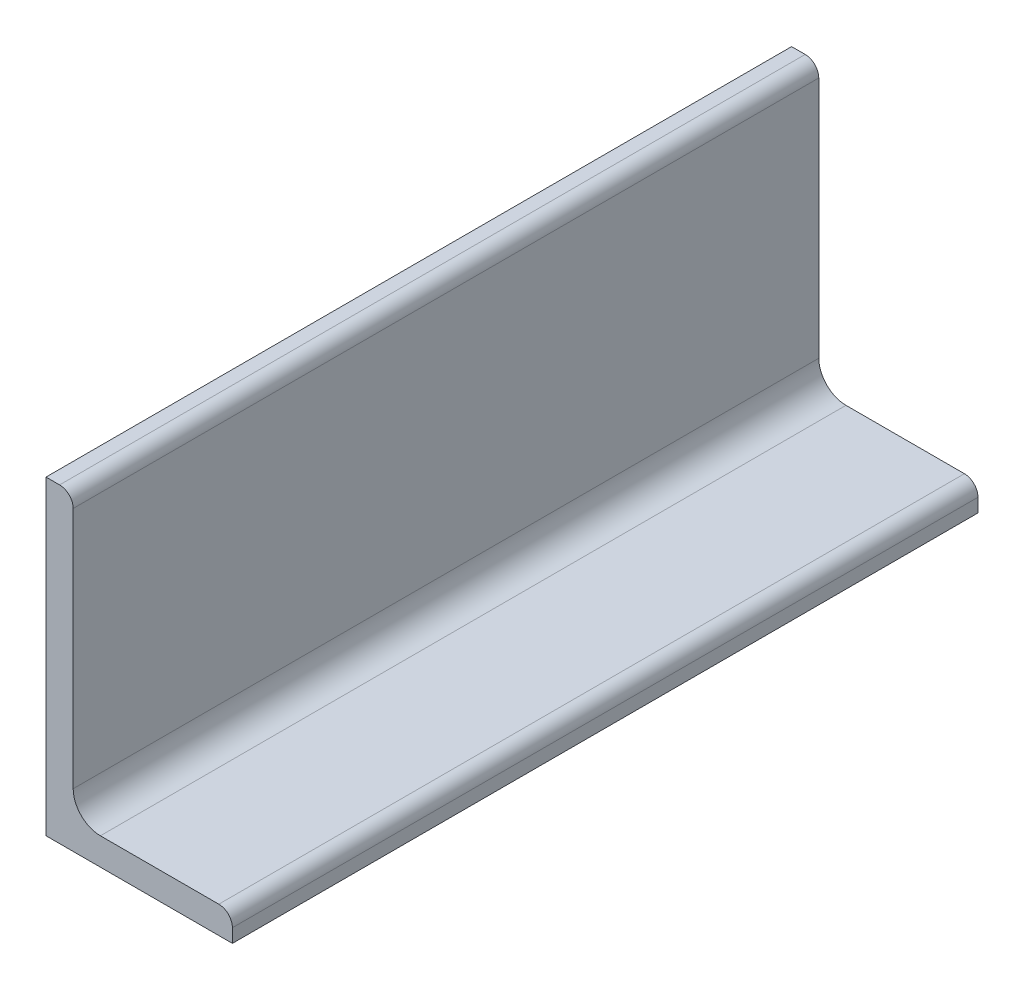
ISO-10303-21;
HEADER;
FILE_DESCRIPTION(('STEP AP214'),'2;1');
FILE_NAME('part.step','',(''),(''),'','','');
FILE_SCHEMA(('AUTOMOTIVE_DESIGN { 1 0 10303 214 1 1 1 1 }'));
ENDSEC;
DATA;
#1=APPLICATION_CONTEXT('core data for automotive mechanical design processes');
#2=APPLICATION_PROTOCOL_DEFINITION('international standard','automotive_design',2000,#1);
#3=PRODUCT_CONTEXT('',#1,'mechanical');
#4=PRODUCT('Part','Part','',(#3));
#5=PRODUCT_RELATED_PRODUCT_CATEGORY('part','',(#4));
#6=PRODUCT_DEFINITION_FORMATION('','',#4);
#7=PRODUCT_DEFINITION_CONTEXT('part definition',#1,'design');
#8=PRODUCT_DEFINITION('design','',#6,#7);
#9=PRODUCT_DEFINITION_SHAPE('','',#8);
#10=(LENGTH_UNIT() NAMED_UNIT(*) SI_UNIT(.MILLI.,.METRE.));
#11=(NAMED_UNIT(*) PLANE_ANGLE_UNIT() SI_UNIT($,.RADIAN.));
#12=(NAMED_UNIT(*) SI_UNIT($,.STERADIAN.) SOLID_ANGLE_UNIT());
#13=UNCERTAINTY_MEASURE_WITH_UNIT(LENGTH_MEASURE(1.E-05),#10,'distance_accuracy_value','');
#14=(GEOMETRIC_REPRESENTATION_CONTEXT(3) GLOBAL_UNCERTAINTY_ASSIGNED_CONTEXT((#13)) GLOBAL_UNIT_ASSIGNED_CONTEXT((#10,
#11,#12)) REPRESENTATION_CONTEXT('',''));
#15=CARTESIAN_POINT('',(0.,0.,0.));
#16=DIRECTION('',(0.,0.,1.));
#17=DIRECTION('',(1.,0.,0.));
#18=AXIS2_PLACEMENT_3D('',#15,#16,#17);
#19=CARTESIAN_POINT('',(0.490776827053332,127.041655270204,304.8));
#20=DIRECTION('',(1.,0.,0.));
#21=DIRECTION('',(0.,0.,-1.));
#22=AXIS2_PLACEMENT_3D('',#19,#20,#21);
#23=PLANE('',#22);
#24=DIRECTION('',(0.,-1.,0.));
#25=VECTOR('',#24,1.);
#26=CARTESIAN_POINT('',(0.490776827053332,127.041655270204,0.));
#27=LINE('',#26,#25);
#28=CARTESIAN_POINT('',(0.490776827053332,127.041655270204,0.));
#29=VERTEX_POINT('',#28);
#30=CARTESIAN_POINT('',(0.490776827053332,0.0416552702040917,0.));
#31=VERTEX_POINT('',#30);
#32=EDGE_CURVE('E135',#29,#31,#27,.T.);
#33=ORIENTED_EDGE('',*,*,#32,.T.);
#34=DIRECTION('',(0.,0.,-1.));
#35=VECTOR('',#34,1.);
#36=CARTESIAN_POINT('',(0.490776827053332,0.0416552702040917,304.8));
#37=LINE('',#36,#35);
#38=CARTESIAN_POINT('',(0.490776827053332,0.0416552702040917,304.8));
#39=VERTEX_POINT('',#38);
#40=EDGE_CURVE('E11',#39,#31,#37,.T.);
#41=ORIENTED_EDGE('',*,*,#40,.F.);
#42=DIRECTION('',(0.,-1.,0.));
#43=VECTOR('',#42,1.);
#44=CARTESIAN_POINT('',(0.490776827053332,127.041655270204,304.8));
#45=LINE('',#44,#43);
#46=CARTESIAN_POINT('',(0.490776827053332,127.041655270204,304.8));
#47=VERTEX_POINT('',#46);
#48=EDGE_CURVE('E151',#47,#39,#45,.T.);
#49=ORIENTED_EDGE('',*,*,#48,.F.);
#50=DIRECTION('',(0.,0.,-1.));
#51=VECTOR('',#50,1.);
#52=CARTESIAN_POINT('',(0.490776827053332,127.041655270204,304.8));
#53=LINE('',#52,#51);
#54=EDGE_CURVE('E131',#47,#29,#53,.T.);
#55=ORIENTED_EDGE('',*,*,#54,.T.);
#56=EDGE_LOOP('',(#33,#41,#49,#55));
#57=FACE_BOUND('',#56,.T.);
#58=ADVANCED_FACE('F33',(#57),#23,.F.);
#59=CARTESIAN_POINT('',(0.490776827053332,0.0416552702040917,304.8));
#60=DIRECTION('',(0.,1.,0.));
#61=DIRECTION('',(0.,0.,1.));
#62=AXIS2_PLACEMENT_3D('',#59,#60,#61);
#63=PLANE('',#62);
#64=DIRECTION('',(1.,0.,0.));
#65=VECTOR('',#64,1.);
#66=CARTESIAN_POINT('',(0.490776827053332,0.0416552702040917,0.));
#67=LINE('',#66,#65);
#68=CARTESIAN_POINT('',(76.6907768270533,0.0416552702040917,0.));
#69=VERTEX_POINT('',#68);
#70=EDGE_CURVE('E138',#31,#69,#67,.T.);
#71=ORIENTED_EDGE('',*,*,#70,.T.);
#72=DIRECTION('',(0.,0.,-1.));
#73=VECTOR('',#72,1.);
#74=CARTESIAN_POINT('',(76.6907768270533,0.0416552702040917,304.8));
#75=LINE('',#74,#73);
#76=CARTESIAN_POINT('',(76.6907768270533,0.0416552702040917,304.8));
#77=VERTEX_POINT('',#76);
#78=EDGE_CURVE('E41',#77,#69,#75,.T.);
#79=ORIENTED_EDGE('',*,*,#78,.F.);
#80=DIRECTION('',(1.,0.,0.));
#81=VECTOR('',#80,1.);
#82=CARTESIAN_POINT('',(0.490776827053332,0.0416552702040917,304.8));
#83=LINE('',#82,#81);
#84=EDGE_CURVE('E95',#39,#77,#83,.T.);
#85=ORIENTED_EDGE('',*,*,#84,.F.);
#86=ORIENTED_EDGE('',*,*,#40,.T.);
#87=EDGE_LOOP('',(#71,#79,#85,#86));
#88=FACE_BOUND('',#87,.T.);
#89=ADVANCED_FACE('F194',(#88),#63,.F.);
#90=CARTESIAN_POINT('',(76.6907768270533,0.0416552702040917,304.8));
#91=DIRECTION('',(-1.,0.,0.));
#92=DIRECTION('',(0.,0.,1.));
#93=AXIS2_PLACEMENT_3D('',#90,#91,#92);
#94=PLANE('',#93);
#95=DIRECTION('',(0.,1.,0.));
#96=VECTOR('',#95,1.);
#97=CARTESIAN_POINT('',(76.6907768270533,0.0416552702040917,0.));
#98=LINE('',#97,#96);
#99=CARTESIAN_POINT('',(76.6907768270533,5.59790527020409,0.));
#100=VERTEX_POINT('',#99);
#101=EDGE_CURVE('E140',#69,#100,#98,.T.);
#102=ORIENTED_EDGE('',*,*,#101,.T.);
#103=DIRECTION('',(0.,0.,-1.));
#104=VECTOR('',#103,1.);
#105=CARTESIAN_POINT('',(76.6907768270533,5.59790527020409,304.8));
#106=LINE('',#105,#104);
#107=CARTESIAN_POINT('',(76.6907768270533,5.59790527020409,304.8));
#108=VERTEX_POINT('',#107);
#109=EDGE_CURVE('E161',#108,#100,#106,.T.);
#110=ORIENTED_EDGE('',*,*,#109,.F.);
#111=DIRECTION('',(0.,1.,0.));
#112=VECTOR('',#111,1.);
#113=CARTESIAN_POINT('',(76.6907768270533,0.0416552702040917,304.8));
#114=LINE('',#113,#112);
#115=EDGE_CURVE('E169',#77,#108,#114,.T.);
#116=ORIENTED_EDGE('',*,*,#115,.F.);
#117=ORIENTED_EDGE('',*,*,#78,.T.);
#118=EDGE_LOOP('',(#102,#110,#116,#117));
#119=FACE_BOUND('',#118,.T.);
#120=ADVANCED_FACE('F167',(#119),#94,.F.);
#121=CARTESIAN_POINT('',(71.1345268270533,5.59790527020409,304.8));
#122=DIRECTION('',(0.,0.,-1.));
#123=DIRECTION('',(-1.,0.,0.));
#124=AXIS2_PLACEMENT_3D('',#121,#122,#123);
#125=CYLINDRICAL_SURFACE('',#124,5.55625);
#126=CARTESIAN_POINT('',(71.1345268270533,5.59790527020409,0.));
#127=DIRECTION('',(0.,0.,1.));
#128=DIRECTION('',(1.,0.,0.));
#129=AXIS2_PLACEMENT_3D('',#126,#127,#128);
#130=CIRCLE('',#129,5.55625);
#131=CARTESIAN_POINT('',(71.1345268270533,11.1541552702041,0.));
#132=VERTEX_POINT('',#131);
#133=EDGE_CURVE('E142',#100,#132,#130,.T.);
#134=ORIENTED_EDGE('',*,*,#133,.T.);
#135=DIRECTION('',(0.,0.,-1.));
#136=VECTOR('',#135,1.);
#137=CARTESIAN_POINT('',(71.1345268270533,11.1541552702041,304.8));
#138=LINE('',#137,#136);
#139=CARTESIAN_POINT('',(71.1345268270533,11.1541552702041,304.8));
#140=VERTEX_POINT('',#139);
#141=EDGE_CURVE('E158',#140,#132,#138,.T.);
#142=ORIENTED_EDGE('',*,*,#141,.F.);
#143=CARTESIAN_POINT('',(71.1345268270533,5.59790527020409,304.8));
#144=DIRECTION('',(0.,0.,1.));
#145=DIRECTION('',(1.,0.,0.));
#146=AXIS2_PLACEMENT_3D('',#143,#144,#145);
#147=CIRCLE('',#146,5.55625);
#148=EDGE_CURVE('E185',#108,#140,#147,.T.);
#149=ORIENTED_EDGE('',*,*,#148,.F.);
#150=ORIENTED_EDGE('',*,*,#109,.T.);
#151=EDGE_LOOP('',(#134,#142,#149,#150));
#152=FACE_BOUND('',#151,.T.);
#153=ADVANCED_FACE('F178',(#152),#125,.T.);
#154=CARTESIAN_POINT('',(71.1345268270533,11.1541552702041,304.8));
#155=DIRECTION('',(0.,-1.,0.));
#156=DIRECTION('',(0.,0.,-1.));
#157=AXIS2_PLACEMENT_3D('',#154,#155,#156);
#158=PLANE('',#157);
#159=DIRECTION('',(-1.,0.,0.));
#160=VECTOR('',#159,1.);
#161=CARTESIAN_POINT('',(71.1345268270533,11.1541552702041,0.));
#162=LINE('',#161,#160);
#163=CARTESIAN_POINT('',(22.7157768270533,11.1541552702041,0.));
#164=VERTEX_POINT('',#163);
#165=EDGE_CURVE('E144',#132,#164,#162,.T.);
#166=ORIENTED_EDGE('',*,*,#165,.T.);
#167=DIRECTION('',(0.,0.,-1.));
#168=VECTOR('',#167,1.);
#169=CARTESIAN_POINT('',(22.7157768270533,11.1541552702041,304.8));
#170=LINE('',#169,#168);
#171=CARTESIAN_POINT('',(22.7157768270533,11.1541552702041,304.8));
#172=VERTEX_POINT('',#171);
#173=EDGE_CURVE('E155',#172,#164,#170,.T.);
#174=ORIENTED_EDGE('',*,*,#173,.F.);
#175=DIRECTION('',(-1.,0.,0.));
#176=VECTOR('',#175,1.);
#177=CARTESIAN_POINT('',(71.1345268270533,11.1541552702041,304.8));
#178=LINE('',#177,#176);
#179=EDGE_CURVE('E184',#140,#172,#178,.T.);
#180=ORIENTED_EDGE('',*,*,#179,.F.);
#181=ORIENTED_EDGE('',*,*,#141,.T.);
#182=EDGE_LOOP('',(#166,#174,#180,#181));
#183=FACE_BOUND('',#182,.T.);
#184=ADVANCED_FACE('F182',(#183),#158,.F.);
#185=CARTESIAN_POINT('',(22.7157768270533,22.2666552702041,304.8));
#186=DIRECTION('',(0.,0.,-1.));
#187=DIRECTION('',(-1.,0.,0.));
#188=AXIS2_PLACEMENT_3D('',#185,#186,#187);
#189=CYLINDRICAL_SURFACE('',#188,11.1125);
#190=CARTESIAN_POINT('',(22.7157768270533,22.2666552702041,0.));
#191=DIRECTION('',(0.,0.,-1.));
#192=DIRECTION('',(1.,0.,0.));
#193=AXIS2_PLACEMENT_3D('',#190,#191,#192);
#194=CIRCLE('',#193,11.1125);
#195=CARTESIAN_POINT('',(11.6032768270533,22.2666552702041,0.));
#196=VERTEX_POINT('',#195);
#197=EDGE_CURVE('E146',#164,#196,#194,.T.);
#198=ORIENTED_EDGE('',*,*,#197,.T.);
#199=DIRECTION('',(0.,0.,-1.));
#200=VECTOR('',#199,1.);
#201=CARTESIAN_POINT('',(11.6032768270533,22.2666552702041,304.8));
#202=LINE('',#201,#200);
#203=CARTESIAN_POINT('',(11.6032768270533,22.2666552702041,304.8));
#204=VERTEX_POINT('',#203);
#205=EDGE_CURVE('E126',#204,#196,#202,.T.);
#206=ORIENTED_EDGE('',*,*,#205,.F.);
#207=CARTESIAN_POINT('',(22.7157768270533,22.2666552702041,304.8));
#208=DIRECTION('',(0.,0.,-1.));
#209=DIRECTION('',(1.,0.,0.));
#210=AXIS2_PLACEMENT_3D('',#207,#208,#209);
#211=CIRCLE('',#210,11.1125);
#212=EDGE_CURVE('E117',#172,#204,#211,.T.);
#213=ORIENTED_EDGE('',*,*,#212,.F.);
#214=ORIENTED_EDGE('',*,*,#173,.T.);
#215=EDGE_LOOP('',(#198,#206,#213,#214));
#216=FACE_BOUND('',#215,.T.);
#217=ADVANCED_FACE('F206',(#216),#189,.F.);
#218=CARTESIAN_POINT('',(11.6032768270533,22.2666552702041,304.8));
#219=DIRECTION('',(-1.,0.,0.));
#220=DIRECTION('',(0.,0.,1.));
#221=AXIS2_PLACEMENT_3D('',#218,#219,#220);
#222=PLANE('',#221);
#223=DIRECTION('',(0.,1.,0.));
#224=VECTOR('',#223,1.);
#225=CARTESIAN_POINT('',(11.6032768270533,22.2666552702041,0.));
#226=LINE('',#225,#224);
#227=CARTESIAN_POINT('',(11.6032768270533,121.485405270204,0.));
#228=VERTEX_POINT('',#227);
#229=EDGE_CURVE('E125',#196,#228,#226,.T.);
#230=ORIENTED_EDGE('',*,*,#229,.T.);
#231=DIRECTION('',(0.,0.,-1.));
#232=VECTOR('',#231,1.);
#233=CARTESIAN_POINT('',(11.6032768270533,121.485405270204,304.8));
#234=LINE('',#233,#232);
#235=CARTESIAN_POINT('',(11.6032768270533,121.485405270204,304.8));
#236=VERTEX_POINT('',#235);
#237=EDGE_CURVE('E122',#236,#228,#234,.T.);
#238=ORIENTED_EDGE('',*,*,#237,.F.);
#239=DIRECTION('',(0.,1.,0.));
#240=VECTOR('',#239,1.);
#241=CARTESIAN_POINT('',(11.6032768270533,22.2666552702041,304.8));
#242=LINE('',#241,#240);
#243=EDGE_CURVE('E111',#204,#236,#242,.T.);
#244=ORIENTED_EDGE('',*,*,#243,.F.);
#245=ORIENTED_EDGE('',*,*,#205,.T.);
#246=EDGE_LOOP('',(#230,#238,#244,#245));
#247=FACE_BOUND('',#246,.T.);
#248=ADVANCED_FACE('F123',(#247),#222,.F.);
#249=CARTESIAN_POINT('',(6.04702682705334,121.485405270204,304.8));
#250=DIRECTION('',(0.,0.,-1.));
#251=DIRECTION('',(-1.,0.,0.));
#252=AXIS2_PLACEMENT_3D('',#249,#250,#251);
#253=CYLINDRICAL_SURFACE('',#252,5.55625);
#254=CARTESIAN_POINT('',(6.04702682705334,121.485405270204,0.));
#255=DIRECTION('',(0.,0.,1.));
#256=DIRECTION('',(1.,0.,0.));
#257=AXIS2_PLACEMENT_3D('',#254,#255,#256);
#258=CIRCLE('',#257,5.55625);
#259=CARTESIAN_POINT('',(6.04702682705333,127.041655270204,0.));
#260=VERTEX_POINT('',#259);
#261=EDGE_CURVE('E81',#228,#260,#258,.T.);
#262=ORIENTED_EDGE('',*,*,#261,.T.);
#263=DIRECTION('',(0.,0.,-1.));
#264=VECTOR('',#263,1.);
#265=CARTESIAN_POINT('',(6.04702682705333,127.041655270204,304.8));
#266=LINE('',#265,#264);
#267=CARTESIAN_POINT('',(6.04702682705333,127.041655270204,304.8));
#268=VERTEX_POINT('',#267);
#269=EDGE_CURVE('E127',#268,#260,#266,.T.);
#270=ORIENTED_EDGE('',*,*,#269,.F.);
#271=CARTESIAN_POINT('',(6.04702682705334,121.485405270204,304.8));
#272=DIRECTION('',(0.,0.,1.));
#273=DIRECTION('',(1.,0.,0.));
#274=AXIS2_PLACEMENT_3D('',#271,#272,#273);
#275=CIRCLE('',#274,5.55625);
#276=EDGE_CURVE('E115',#236,#268,#275,.T.);
#277=ORIENTED_EDGE('',*,*,#276,.F.);
#278=ORIENTED_EDGE('',*,*,#237,.T.);
#279=EDGE_LOOP('',(#262,#270,#277,#278));
#280=FACE_BOUND('',#279,.T.);
#281=ADVANCED_FACE('F129',(#280),#253,.T.);
#282=CARTESIAN_POINT('',(6.04702682705333,127.041655270204,304.8));
#283=DIRECTION('',(0.,-1.,0.));
#284=DIRECTION('',(0.,0.,-1.));
#285=AXIS2_PLACEMENT_3D('',#282,#283,#284);
#286=PLANE('',#285);
#287=DIRECTION('',(-1.,0.,0.));
#288=VECTOR('',#287,1.);
#289=CARTESIAN_POINT('',(6.04702682705333,127.041655270204,0.));
#290=LINE('',#289,#288);
#291=EDGE_CURVE('E87',#260,#29,#290,.T.);
#292=ORIENTED_EDGE('',*,*,#291,.T.);
#293=ORIENTED_EDGE('',*,*,#54,.F.);
#294=DIRECTION('',(-1.,0.,0.));
#295=VECTOR('',#294,1.);
#296=CARTESIAN_POINT('',(6.04702682705333,127.041655270204,304.8));
#297=LINE('',#296,#295);
#298=EDGE_CURVE('E49',#268,#47,#297,.T.);
#299=ORIENTED_EDGE('',*,*,#298,.F.);
#300=ORIENTED_EDGE('',*,*,#269,.T.);
#301=EDGE_LOOP('',(#292,#293,#299,#300));
#302=FACE_BOUND('',#301,.T.);
#303=ADVANCED_FACE('F214',(#302),#286,.F.);
#304=CARTESIAN_POINT('',(71.1345268270533,5.59790527020409,304.8));
#305=DIRECTION('',(0.,0.,1.));
#306=DIRECTION('',(1.,0.,0.));
#307=AXIS2_PLACEMENT_3D('',#304,#305,#306);
#308=PLANE('',#307);
#309=ORIENTED_EDGE('',*,*,#48,.T.);
#310=ORIENTED_EDGE('',*,*,#84,.T.);
#311=ORIENTED_EDGE('',*,*,#115,.T.);
#312=ORIENTED_EDGE('',*,*,#148,.T.);
#313=ORIENTED_EDGE('',*,*,#179,.T.);
#314=ORIENTED_EDGE('',*,*,#212,.T.);
#315=ORIENTED_EDGE('',*,*,#243,.T.);
#316=ORIENTED_EDGE('',*,*,#276,.T.);
#317=ORIENTED_EDGE('',*,*,#298,.T.);
#318=EDGE_LOOP('',(#309,#310,#311,#312,#313,#314,#315,#316,#317));
#319=FACE_BOUND('',#318,.T.);
#320=ADVANCED_FACE('F113',(#319),#308,.T.);
#321=CARTESIAN_POINT('',(71.1345268270533,5.59790527020409,0.));
#322=DIRECTION('',(0.,0.,1.));
#323=DIRECTION('',(1.,0.,0.));
#324=AXIS2_PLACEMENT_3D('',#321,#322,#323);
#325=PLANE('',#324);
#326=ORIENTED_EDGE('',*,*,#32,.F.);
#327=ORIENTED_EDGE('',*,*,#291,.F.);
#328=ORIENTED_EDGE('',*,*,#261,.F.);
#329=ORIENTED_EDGE('',*,*,#229,.F.);
#330=ORIENTED_EDGE('',*,*,#197,.F.);
#331=ORIENTED_EDGE('',*,*,#165,.F.);
#332=ORIENTED_EDGE('',*,*,#133,.F.);
#333=ORIENTED_EDGE('',*,*,#101,.F.);
#334=ORIENTED_EDGE('',*,*,#70,.F.);
#335=EDGE_LOOP('',(#326,#327,#328,#329,#330,#331,#332,#333,#334));
#336=FACE_BOUND('',#335,.T.);
#337=ADVANCED_FACE('F173',(#336),#325,.F.);
#338=CLOSED_SHELL('',(#58,#89,#120,#153,#184,#217,#248,#281,#303,#320,#337));
#339=MANIFOLD_SOLID_BREP('B2',#338);
#340=ADVANCED_BREP_SHAPE_REPRESENTATION('',(#18,#339),#14);
#341=SHAPE_DEFINITION_REPRESENTATION(#9,#340);
ENDSEC;
END-ISO-10303-21;
